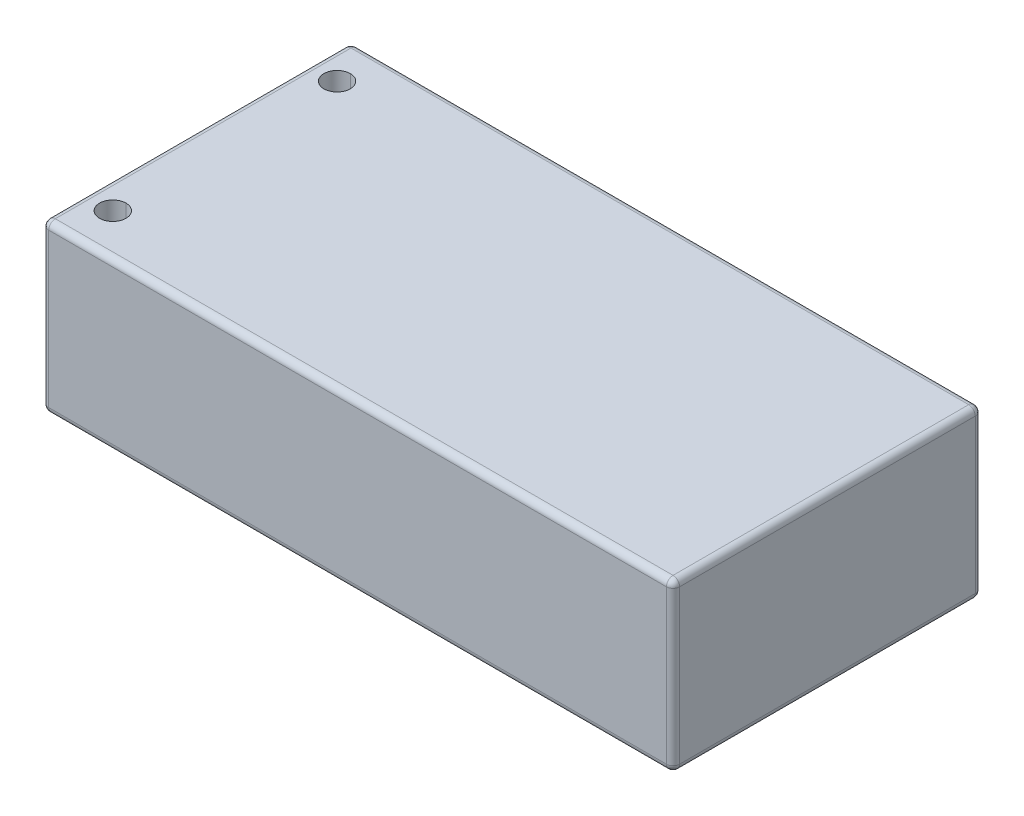
ISO-10303-21;
HEADER;
FILE_DESCRIPTION(('STEP AP214'),'2;1');
FILE_NAME('part.step','',(''),(''),'','','');
FILE_SCHEMA(('AUTOMOTIVE_DESIGN { 1 0 10303 214 1 1 1 1 }'));
ENDSEC;
DATA;
#1=APPLICATION_CONTEXT('core data for automotive mechanical design processes');
#2=APPLICATION_PROTOCOL_DEFINITION('international standard','automotive_design',2000,#1);
#3=PRODUCT_CONTEXT('',#1,'mechanical');
#4=PRODUCT('Part','Part','',(#3));
#5=PRODUCT_RELATED_PRODUCT_CATEGORY('part','',(#4));
#6=PRODUCT_DEFINITION_FORMATION('','',#4);
#7=PRODUCT_DEFINITION_CONTEXT('part definition',#1,'design');
#8=PRODUCT_DEFINITION('design','',#6,#7);
#9=PRODUCT_DEFINITION_SHAPE('','',#8);
#10=(LENGTH_UNIT() NAMED_UNIT(*) SI_UNIT(.MILLI.,.METRE.));
#11=(NAMED_UNIT(*) PLANE_ANGLE_UNIT() SI_UNIT($,.RADIAN.));
#12=(NAMED_UNIT(*) SI_UNIT($,.STERADIAN.) SOLID_ANGLE_UNIT());
#13=UNCERTAINTY_MEASURE_WITH_UNIT(LENGTH_MEASURE(1.E-05),#10,'distance_accuracy_value','');
#14=(GEOMETRIC_REPRESENTATION_CONTEXT(3) GLOBAL_UNCERTAINTY_ASSIGNED_CONTEXT((#13)) GLOBAL_UNIT_ASSIGNED_CONTEXT((#10,
#11,#12)) REPRESENTATION_CONTEXT('',''));
#15=CARTESIAN_POINT('',(0.,0.,0.));
#16=DIRECTION('',(0.,0.,1.));
#17=DIRECTION('',(1.,0.,0.));
#18=AXIS2_PLACEMENT_3D('',#15,#16,#17);
#19=CARTESIAN_POINT('',(4.3,22.25,-40.35));
#20=DIRECTION('',(0.,1.,0.));
#21=DIRECTION('',(1.,0.,0.));
#22=AXIS2_PLACEMENT_3D('',#19,#20,#21);
#23=PLANE('',#22);
#24=CARTESIAN_POINT('',(4.3,22.25,-40.35));
#25=DIRECTION('',(0.,1.,0.));
#26=DIRECTION('',(0.,0.,1.));
#27=AXIS2_PLACEMENT_3D('',#24,#25,#26);
#28=CIRCLE('',#27,2.);
#29=CARTESIAN_POINT('',(4.3,22.25,-38.35));
#30=VERTEX_POINT('',#29);
#31=CARTESIAN_POINT('',(4.3,22.25,-42.35));
#32=VERTEX_POINT('',#31);
#33=EDGE_CURVE('E10',#30,#32,#28,.T.);
#34=ORIENTED_EDGE('',*,*,#33,.T.);
#35=CARTESIAN_POINT('',(4.3,22.25,-40.35));
#36=DIRECTION('',(0.,1.,0.));
#37=DIRECTION('',(0.,0.,1.));
#38=AXIS2_PLACEMENT_3D('',#35,#36,#37);
#39=CIRCLE('',#38,2.);
#40=EDGE_CURVE('E304',#32,#30,#39,.T.);
#41=ORIENTED_EDGE('',*,*,#40,.T.);
#42=EDGE_LOOP('',(#34,#41));
#43=FACE_BOUND('',#42,.T.);
#44=ADVANCED_FACE('F16',(#43),#23,.T.);
#45=CARTESIAN_POINT('',(4.3,22.25,-40.35));
#46=DIRECTION('',(0.,1.,0.));
#47=DIRECTION('',(0.,0.,1.));
#48=AXIS2_PLACEMENT_3D('',#45,#46,#47);
#49=CYLINDRICAL_SURFACE('',#48,2.);
#50=DIRECTION('',(0.,1.,0.));
#51=VECTOR('',#50,1.);
#52=CARTESIAN_POINT('',(4.3,22.25,-42.35));
#53=LINE('',#52,#51);
#54=CARTESIAN_POINT('',(4.3,25.25,-42.35));
#55=VERTEX_POINT('',#54);
#56=EDGE_CURVE('E303',#32,#55,#53,.T.);
#57=ORIENTED_EDGE('',*,*,#56,.F.);
#58=ORIENTED_EDGE('',*,*,#33,.F.);
#59=DIRECTION('',(0.,1.,0.));
#60=VECTOR('',#59,1.);
#61=CARTESIAN_POINT('',(4.3,22.25,-38.35));
#62=LINE('',#61,#60);
#63=CARTESIAN_POINT('',(4.3,25.25,-38.35));
#64=VERTEX_POINT('',#63);
#65=EDGE_CURVE('E232',#30,#64,#62,.T.);
#66=ORIENTED_EDGE('',*,*,#65,.T.);
#67=CARTESIAN_POINT('',(4.3,25.25,-40.35));
#68=DIRECTION('',(0.,1.,0.));
#69=DIRECTION('',(0.,0.,1.));
#70=AXIS2_PLACEMENT_3D('',#67,#68,#69);
#71=CIRCLE('',#70,2.);
#72=EDGE_CURVE('E339',#64,#55,#71,.T.);
#73=ORIENTED_EDGE('',*,*,#72,.T.);
#74=EDGE_LOOP('',(#57,#58,#66,#73));
#75=FACE_BOUND('',#74,.T.);
#76=ADVANCED_FACE('F614',(#75),#49,.F.);
#77=CARTESIAN_POINT('',(4.3,22.25,-6.4));
#78=DIRECTION('',(0.,1.,0.));
#79=DIRECTION('',(1.,0.,0.));
#80=AXIS2_PLACEMENT_3D('',#77,#78,#79);
#81=PLANE('',#80);
#82=CARTESIAN_POINT('',(4.3,22.25,-6.4));
#83=DIRECTION('',(0.,1.,0.));
#84=DIRECTION('',(0.,0.,1.));
#85=AXIS2_PLACEMENT_3D('',#82,#83,#84);
#86=CIRCLE('',#85,2.);
#87=CARTESIAN_POINT('',(4.3,22.25,-4.4));
#88=VERTEX_POINT('',#87);
#89=CARTESIAN_POINT('',(4.3,22.25,-8.4));
#90=VERTEX_POINT('',#89);
#91=EDGE_CURVE('E27',#88,#90,#86,.T.);
#92=ORIENTED_EDGE('',*,*,#91,.T.);
#93=CARTESIAN_POINT('',(4.3,22.25,-6.4));
#94=DIRECTION('',(0.,1.,0.));
#95=DIRECTION('',(0.,0.,1.));
#96=AXIS2_PLACEMENT_3D('',#93,#94,#95);
#97=CIRCLE('',#96,2.);
#98=EDGE_CURVE('E236',#90,#88,#97,.T.);
#99=ORIENTED_EDGE('',*,*,#98,.T.);
#100=EDGE_LOOP('',(#92,#99));
#101=FACE_BOUND('',#100,.T.);
#102=ADVANCED_FACE('F443',(#101),#81,.T.);
#103=CARTESIAN_POINT('',(4.3,22.25,-6.4));
#104=DIRECTION('',(0.,1.,0.));
#105=DIRECTION('',(0.,0.,1.));
#106=AXIS2_PLACEMENT_3D('',#103,#104,#105);
#107=CYLINDRICAL_SURFACE('',#106,2.);
#108=DIRECTION('',(0.,1.,0.));
#109=VECTOR('',#108,1.);
#110=CARTESIAN_POINT('',(4.3,22.25,-8.4));
#111=LINE('',#110,#109);
#112=CARTESIAN_POINT('',(4.3,25.25,-8.4));
#113=VERTEX_POINT('',#112);
#114=EDGE_CURVE('E219',#90,#113,#111,.T.);
#115=ORIENTED_EDGE('',*,*,#114,.F.);
#116=ORIENTED_EDGE('',*,*,#91,.F.);
#117=DIRECTION('',(0.,1.,0.));
#118=VECTOR('',#117,1.);
#119=CARTESIAN_POINT('',(4.3,22.25,-4.4));
#120=LINE('',#119,#118);
#121=CARTESIAN_POINT('',(4.3,25.25,-4.4));
#122=VERTEX_POINT('',#121);
#123=EDGE_CURVE('E218',#88,#122,#120,.T.);
#124=ORIENTED_EDGE('',*,*,#123,.T.);
#125=CARTESIAN_POINT('',(4.3,25.25,-6.4));
#126=DIRECTION('',(0.,1.,0.));
#127=DIRECTION('',(0.,0.,1.));
#128=AXIS2_PLACEMENT_3D('',#125,#126,#127);
#129=CIRCLE('',#128,2.);
#130=EDGE_CURVE('E20',#122,#113,#129,.T.);
#131=ORIENTED_EDGE('',*,*,#130,.T.);
#132=EDGE_LOOP('',(#115,#116,#124,#131));
#133=FACE_BOUND('',#132,.T.);
#134=ADVANCED_FACE('F450',(#133),#107,.F.);
#135=CARTESIAN_POINT('',(1.,25.25,-45.75));
#136=DIRECTION('',(0.,-1.,0.));
#137=DIRECTION('',(0.,0.,-1.));
#138=AXIS2_PLACEMENT_3D('',#135,#136,#137);
#139=CYLINDRICAL_SURFACE('',#138,1.);
#140=CARTESIAN_POINT('',(1.,24.25,-45.75));
#141=DIRECTION('',(0.,-1.,0.));
#142=DIRECTION('',(0.,0.,1.));
#143=AXIS2_PLACEMENT_3D('',#140,#141,#142);
#144=CIRCLE('',#143,1.);
#145=CARTESIAN_POINT('',(0.,24.25,-45.75));
#146=VERTEX_POINT('',#145);
#147=CARTESIAN_POINT('',(1.,24.25,-46.75));
#148=VERTEX_POINT('',#147);
#149=EDGE_CURVE('E345',#146,#148,#144,.T.);
#150=ORIENTED_EDGE('',*,*,#149,.T.);
#151=DIRECTION('',(0.,1.,0.));
#152=VECTOR('',#151,1.);
#153=CARTESIAN_POINT('',(1.,25.25,-46.75));
#154=LINE('',#153,#152);
#155=CARTESIAN_POINT('',(1.,1.,-46.75));
#156=VERTEX_POINT('',#155);
#157=EDGE_CURVE('E354',#156,#148,#154,.T.);
#158=ORIENTED_EDGE('',*,*,#157,.F.);
#159=CARTESIAN_POINT('',(1.,1.,-45.75));
#160=DIRECTION('',(0.,1.,0.));
#161=DIRECTION('',(0.,0.,-1.));
#162=AXIS2_PLACEMENT_3D('',#159,#160,#161);
#163=CIRCLE('',#162,1.);
#164=CARTESIAN_POINT('',(0.,1.,-45.75));
#165=VERTEX_POINT('',#164);
#166=EDGE_CURVE('E348',#156,#165,#163,.T.);
#167=ORIENTED_EDGE('',*,*,#166,.T.);
#168=DIRECTION('',(0.,-1.,0.));
#169=VECTOR('',#168,1.);
#170=CARTESIAN_POINT('',(0.,25.25,-45.75));
#171=LINE('',#170,#169);
#172=EDGE_CURVE('E256',#146,#165,#171,.T.);
#173=ORIENTED_EDGE('',*,*,#172,.F.);
#174=EDGE_LOOP('',(#150,#158,#167,#173));
#175=FACE_BOUND('',#174,.T.);
#176=ADVANCED_FACE('F414',(#175),#139,.T.);
#177=CARTESIAN_POINT('',(1.,1.,-45.75));
#178=DIRECTION('',(0.,1.,0.));
#179=DIRECTION('',(1.,0.,0.));
#180=AXIS2_PLACEMENT_3D('',#177,#178,#179);
#181=SPHERICAL_SURFACE('',#180,1.);
#182=CARTESIAN_POINT('',(1.,1.,-45.75));
#183=DIRECTION('',(-1.,0.,0.));
#184=DIRECTION('',(0.,0.,1.));
#185=AXIS2_PLACEMENT_3D('',#182,#183,#184);
#186=CIRCLE('',#185,1.);
#187=CARTESIAN_POINT('',(1.,0.,-45.75));
#188=VERTEX_POINT('',#187);
#189=EDGE_CURVE('E42',#156,#188,#186,.T.);
#190=ORIENTED_EDGE('',*,*,#189,.T.);
#191=CARTESIAN_POINT('',(1.,1.,-45.75));
#192=DIRECTION('',(0.,0.,-1.));
#193=DIRECTION('',(-1.,0.,0.));
#194=AXIS2_PLACEMENT_3D('',#191,#192,#193);
#195=CIRCLE('',#194,1.);
#196=EDGE_CURVE('E225',#188,#165,#195,.T.);
#197=ORIENTED_EDGE('',*,*,#196,.T.);
#198=ORIENTED_EDGE('',*,*,#166,.F.);
#199=EDGE_LOOP('',(#190,#197,#198));
#200=FACE_BOUND('',#199,.T.);
#201=ADVANCED_FACE('F418',(#200),#181,.T.);
#202=CARTESIAN_POINT('',(1.,24.25,-45.75));
#203=DIRECTION('',(0.,1.,0.));
#204=DIRECTION('',(1.,0.,0.));
#205=AXIS2_PLACEMENT_3D('',#202,#203,#204);
#206=SPHERICAL_SURFACE('',#205,1.);
#207=CARTESIAN_POINT('',(1.,24.25,-45.75));
#208=DIRECTION('',(0.,0.,-1.));
#209=DIRECTION('',(-1.,0.,0.));
#210=AXIS2_PLACEMENT_3D('',#207,#208,#209);
#211=CIRCLE('',#210,1.);
#212=CARTESIAN_POINT('',(1.,25.25,-45.75));
#213=VERTEX_POINT('',#212);
#214=EDGE_CURVE('E228',#146,#213,#211,.T.);
#215=ORIENTED_EDGE('',*,*,#214,.T.);
#216=CARTESIAN_POINT('',(1.,24.25,-45.75));
#217=DIRECTION('',(-1.,0.,0.));
#218=DIRECTION('',(0.,0.,1.));
#219=AXIS2_PLACEMENT_3D('',#216,#217,#218);
#220=CIRCLE('',#219,1.);
#221=EDGE_CURVE('E231',#213,#148,#220,.T.);
#222=ORIENTED_EDGE('',*,*,#221,.T.);
#223=ORIENTED_EDGE('',*,*,#149,.F.);
#224=EDGE_LOOP('',(#215,#222,#223));
#225=FACE_BOUND('',#224,.T.);
#226=ADVANCED_FACE('F650',(#225),#206,.T.);
#227=CARTESIAN_POINT('',(0.,1.,-45.75));
#228=DIRECTION('',(1.,0.,0.));
#229=DIRECTION('',(0.,0.,-1.));
#230=AXIS2_PLACEMENT_3D('',#227,#228,#229);
#231=CYLINDRICAL_SURFACE('',#230,1.);
#232=CARTESIAN_POINT('',(94.5,1.,-45.75));
#233=DIRECTION('',(-1.,0.,0.));
#234=DIRECTION('',(0.,0.,-1.));
#235=AXIS2_PLACEMENT_3D('',#232,#233,#234);
#236=CIRCLE('',#235,1.);
#237=CARTESIAN_POINT('',(94.5,1.,-46.75));
#238=VERTEX_POINT('',#237);
#239=CARTESIAN_POINT('',(94.5,0.,-45.75));
#240=VERTEX_POINT('',#239);
#241=EDGE_CURVE('E245',#238,#240,#236,.T.);
#242=ORIENTED_EDGE('',*,*,#241,.T.);
#243=DIRECTION('',(1.,0.,0.));
#244=VECTOR('',#243,1.);
#245=CARTESIAN_POINT('',(95.5,0.,-45.75));
#246=LINE('',#245,#244);
#247=EDGE_CURVE('E187',#188,#240,#246,.T.);
#248=ORIENTED_EDGE('',*,*,#247,.F.);
#249=ORIENTED_EDGE('',*,*,#189,.F.);
#250=DIRECTION('',(-1.,0.,0.));
#251=VECTOR('',#250,1.);
#252=CARTESIAN_POINT('',(0.,1.,-46.75));
#253=LINE('',#252,#251);
#254=EDGE_CURVE('E344',#238,#156,#253,.T.);
#255=ORIENTED_EDGE('',*,*,#254,.F.);
#256=EDGE_LOOP('',(#242,#248,#249,#255));
#257=FACE_BOUND('',#256,.T.);
#258=ADVANCED_FACE('F644',(#257),#231,.T.);
#259=CARTESIAN_POINT('',(1.,1.,0.));
#260=DIRECTION('',(0.,0.,-1.));
#261=DIRECTION('',(-1.,0.,0.));
#262=AXIS2_PLACEMENT_3D('',#259,#260,#261);
#263=CYLINDRICAL_SURFACE('',#262,1.);
#264=CARTESIAN_POINT('',(1.,1.,-1.));
#265=DIRECTION('',(0.,0.,-1.));
#266=DIRECTION('',(1.,0.,0.));
#267=AXIS2_PLACEMENT_3D('',#264,#265,#266);
#268=CIRCLE('',#267,1.);
#269=CARTESIAN_POINT('',(1.,0.,-1.));
#270=VERTEX_POINT('',#269);
#271=CARTESIAN_POINT('',(0.,1.,-1.));
#272=VERTEX_POINT('',#271);
#273=EDGE_CURVE('E326',#270,#272,#268,.T.);
#274=ORIENTED_EDGE('',*,*,#273,.T.);
#275=DIRECTION('',(0.,0.,1.));
#276=VECTOR('',#275,1.);
#277=CARTESIAN_POINT('',(0.,1.,0.));
#278=LINE('',#277,#276);
#279=EDGE_CURVE('E251',#165,#272,#278,.T.);
#280=ORIENTED_EDGE('',*,*,#279,.F.);
#281=ORIENTED_EDGE('',*,*,#196,.F.);
#282=DIRECTION('',(0.,0.,-1.));
#283=VECTOR('',#282,1.);
#284=CARTESIAN_POINT('',(1.,0.,-46.75));
#285=LINE('',#284,#283);
#286=EDGE_CURVE('E250',#270,#188,#285,.T.);
#287=ORIENTED_EDGE('',*,*,#286,.F.);
#288=EDGE_LOOP('',(#274,#280,#281,#287));
#289=FACE_BOUND('',#288,.T.);
#290=ADVANCED_FACE('F422',(#289),#263,.T.);
#291=CARTESIAN_POINT('',(1.,24.25,0.));
#292=DIRECTION('',(0.,0.,1.));
#293=DIRECTION('',(1.,0.,0.));
#294=AXIS2_PLACEMENT_3D('',#291,#292,#293);
#295=CYLINDRICAL_SURFACE('',#294,1.);
#296=CARTESIAN_POINT('',(1.,24.25,-1.));
#297=DIRECTION('',(0.,0.,-1.));
#298=DIRECTION('',(1.,0.,0.));
#299=AXIS2_PLACEMENT_3D('',#296,#297,#298);
#300=CIRCLE('',#299,1.);
#301=CARTESIAN_POINT('',(0.,24.25,-1.));
#302=VERTEX_POINT('',#301);
#303=CARTESIAN_POINT('',(1.,25.25,-1.));
#304=VERTEX_POINT('',#303);
#305=EDGE_CURVE('E268',#302,#304,#300,.T.);
#306=ORIENTED_EDGE('',*,*,#305,.T.);
#307=DIRECTION('',(0.,0.,1.));
#308=VECTOR('',#307,1.);
#309=CARTESIAN_POINT('',(1.,25.25,0.));
#310=LINE('',#309,#308);
#311=EDGE_CURVE('E319',#213,#304,#310,.T.);
#312=ORIENTED_EDGE('',*,*,#311,.F.);
#313=ORIENTED_EDGE('',*,*,#214,.F.);
#314=DIRECTION('',(0.,0.,-1.));
#315=VECTOR('',#314,1.);
#316=CARTESIAN_POINT('',(0.,24.25,0.));
#317=LINE('',#316,#315);
#318=EDGE_CURVE('E259',#302,#146,#317,.T.);
#319=ORIENTED_EDGE('',*,*,#318,.F.);
#320=EDGE_LOOP('',(#306,#312,#313,#319));
#321=FACE_BOUND('',#320,.T.);
#322=ADVANCED_FACE('F643',(#321),#295,.T.);
#323=CARTESIAN_POINT('',(0.,24.25,-45.75));
#324=DIRECTION('',(-1.,0.,0.));
#325=DIRECTION('',(0.,0.,1.));
#326=AXIS2_PLACEMENT_3D('',#323,#324,#325);
#327=CYLINDRICAL_SURFACE('',#326,1.);
#328=CARTESIAN_POINT('',(94.5,24.25,-45.75));
#329=DIRECTION('',(-1.,0.,0.));
#330=DIRECTION('',(0.,0.,-1.));
#331=AXIS2_PLACEMENT_3D('',#328,#329,#330);
#332=CIRCLE('',#331,1.);
#333=CARTESIAN_POINT('',(94.5,25.25,-45.75));
#334=VERTEX_POINT('',#333);
#335=CARTESIAN_POINT('',(94.5,24.25,-46.75));
#336=VERTEX_POINT('',#335);
#337=EDGE_CURVE('E266',#334,#336,#332,.T.);
#338=ORIENTED_EDGE('',*,*,#337,.T.);
#339=DIRECTION('',(1.,0.,0.));
#340=VECTOR('',#339,1.);
#341=CARTESIAN_POINT('',(0.,24.25,-46.75));
#342=LINE('',#341,#340);
#343=EDGE_CURVE('E358',#148,#336,#342,.T.);
#344=ORIENTED_EDGE('',*,*,#343,.F.);
#345=ORIENTED_EDGE('',*,*,#221,.F.);
#346=DIRECTION('',(-1.,0.,0.));
#347=VECTOR('',#346,1.);
#348=CARTESIAN_POINT('',(0.,25.25,-45.75));
#349=LINE('',#348,#347);
#350=EDGE_CURVE('E324',#334,#213,#349,.T.);
#351=ORIENTED_EDGE('',*,*,#350,.F.);
#352=EDGE_LOOP('',(#338,#344,#345,#351));
#353=FACE_BOUND('',#352,.T.);
#354=ADVANCED_FACE('F677',(#353),#327,.T.);
#355=CARTESIAN_POINT('',(94.5,1.,-45.75));
#356=DIRECTION('',(0.,1.,0.));
#357=DIRECTION('',(1.,0.,0.));
#358=AXIS2_PLACEMENT_3D('',#355,#356,#357);
#359=SPHERICAL_SURFACE('',#358,1.);
#360=CARTESIAN_POINT('',(94.5,1.,-45.75));
#361=DIRECTION('',(0.,-1.,0.));
#362=DIRECTION('',(0.,0.,-1.));
#363=AXIS2_PLACEMENT_3D('',#360,#361,#362);
#364=CIRCLE('',#363,1.);
#365=CARTESIAN_POINT('',(95.5,1.,-45.75));
#366=VERTEX_POINT('',#365);
#367=EDGE_CURVE('E269',#238,#366,#364,.T.);
#368=ORIENTED_EDGE('',*,*,#367,.T.);
#369=CARTESIAN_POINT('',(94.5,1.,-45.75));
#370=DIRECTION('',(0.,0.,-1.));
#371=DIRECTION('',(-1.,0.,0.));
#372=AXIS2_PLACEMENT_3D('',#369,#370,#371);
#373=CIRCLE('',#372,1.);
#374=EDGE_CURVE('E286',#366,#240,#373,.T.);
#375=ORIENTED_EDGE('',*,*,#374,.T.);
#376=ORIENTED_EDGE('',*,*,#241,.F.);
#377=EDGE_LOOP('',(#368,#375,#376));
#378=FACE_BOUND('',#377,.T.);
#379=ADVANCED_FACE('F640',(#378),#359,.T.);
#380=CARTESIAN_POINT('',(1.,1.,-1.));
#381=DIRECTION('',(0.,1.,0.));
#382=DIRECTION('',(1.,0.,0.));
#383=AXIS2_PLACEMENT_3D('',#380,#381,#382);
#384=SPHERICAL_SURFACE('',#383,1.);
#385=CARTESIAN_POINT('',(1.,1.,-1.));
#386=DIRECTION('',(-1.,0.,0.));
#387=DIRECTION('',(0.,0.,1.));
#388=AXIS2_PLACEMENT_3D('',#385,#386,#387);
#389=CIRCLE('',#388,1.);
#390=CARTESIAN_POINT('',(1.,1.,0.));
#391=VERTEX_POINT('',#390);
#392=EDGE_CURVE('E376',#270,#391,#389,.T.);
#393=ORIENTED_EDGE('',*,*,#392,.T.);
#394=CARTESIAN_POINT('',(1.,1.,-1.));
#395=DIRECTION('',(0.,-1.,0.));
#396=DIRECTION('',(0.,0.,-1.));
#397=AXIS2_PLACEMENT_3D('',#394,#395,#396);
#398=CIRCLE('',#397,1.);
#399=EDGE_CURVE('E314',#391,#272,#398,.T.);
#400=ORIENTED_EDGE('',*,*,#399,.T.);
#401=ORIENTED_EDGE('',*,*,#273,.F.);
#402=EDGE_LOOP('',(#393,#400,#401));
#403=FACE_BOUND('',#402,.T.);
#404=ADVANCED_FACE('F428',(#403),#384,.T.);
#405=CARTESIAN_POINT('',(1.,24.25,-1.));
#406=DIRECTION('',(0.,1.,0.));
#407=DIRECTION('',(1.,0.,0.));
#408=AXIS2_PLACEMENT_3D('',#405,#406,#407);
#409=SPHERICAL_SURFACE('',#408,1.);
#410=CARTESIAN_POINT('',(1.,24.25,-1.));
#411=DIRECTION('',(0.,1.,0.));
#412=DIRECTION('',(0.,0.,1.));
#413=AXIS2_PLACEMENT_3D('',#410,#411,#412);
#414=CIRCLE('',#413,1.);
#415=CARTESIAN_POINT('',(1.,24.25,0.));
#416=VERTEX_POINT('',#415);
#417=EDGE_CURVE('E318',#302,#416,#414,.T.);
#418=ORIENTED_EDGE('',*,*,#417,.T.);
#419=CARTESIAN_POINT('',(1.,24.25,-1.));
#420=DIRECTION('',(-1.,0.,0.));
#421=DIRECTION('',(0.,0.,1.));
#422=AXIS2_PLACEMENT_3D('',#419,#420,#421);
#423=CIRCLE('',#422,1.);
#424=EDGE_CURVE('E194',#416,#304,#423,.T.);
#425=ORIENTED_EDGE('',*,*,#424,.T.);
#426=ORIENTED_EDGE('',*,*,#305,.F.);
#427=EDGE_LOOP('',(#418,#425,#426));
#428=FACE_BOUND('',#427,.T.);
#429=ADVANCED_FACE('F637',(#428),#409,.T.);
#430=CARTESIAN_POINT('',(94.5,24.25,-45.75));
#431=DIRECTION('',(0.,1.,0.));
#432=DIRECTION('',(1.,0.,0.));
#433=AXIS2_PLACEMENT_3D('',#430,#431,#432);
#434=SPHERICAL_SURFACE('',#433,1.);
#435=CARTESIAN_POINT('',(94.5,24.25,-45.75));
#436=DIRECTION('',(0.,0.,-1.));
#437=DIRECTION('',(-1.,0.,0.));
#438=AXIS2_PLACEMENT_3D('',#435,#436,#437);
#439=CIRCLE('',#438,1.);
#440=CARTESIAN_POINT('',(95.5,24.25,-45.75));
#441=VERTEX_POINT('',#440);
#442=EDGE_CURVE('E223',#334,#441,#439,.T.);
#443=ORIENTED_EDGE('',*,*,#442,.T.);
#444=CARTESIAN_POINT('',(94.5,24.25,-45.75));
#445=DIRECTION('',(0.,1.,0.));
#446=DIRECTION('',(0.,0.,1.));
#447=AXIS2_PLACEMENT_3D('',#444,#445,#446);
#448=CIRCLE('',#447,1.);
#449=EDGE_CURVE('E328',#441,#336,#448,.T.);
#450=ORIENTED_EDGE('',*,*,#449,.T.);
#451=ORIENTED_EDGE('',*,*,#337,.F.);
#452=EDGE_LOOP('',(#443,#450,#451));
#453=FACE_BOUND('',#452,.T.);
#454=ADVANCED_FACE('F631',(#453),#434,.T.);
#455=CARTESIAN_POINT('',(94.5,25.25,-45.75));
#456=DIRECTION('',(0.,-1.,0.));
#457=DIRECTION('',(0.,0.,-1.));
#458=AXIS2_PLACEMENT_3D('',#455,#456,#457);
#459=CYLINDRICAL_SURFACE('',#458,1.);
#460=ORIENTED_EDGE('',*,*,#449,.F.);
#461=DIRECTION('',(0.,1.,0.));
#462=VECTOR('',#461,1.);
#463=CARTESIAN_POINT('',(95.5,25.25,-45.75));
#464=LINE('',#463,#462);
#465=EDGE_CURVE('E260',#366,#441,#464,.T.);
#466=ORIENTED_EDGE('',*,*,#465,.F.);
#467=ORIENTED_EDGE('',*,*,#367,.F.);
#468=DIRECTION('',(0.,-1.,0.));
#469=VECTOR('',#468,1.);
#470=CARTESIAN_POINT('',(94.5,25.25,-46.75));
#471=LINE('',#470,#469);
#472=EDGE_CURVE('E340',#336,#238,#471,.T.);
#473=ORIENTED_EDGE('',*,*,#472,.F.);
#474=EDGE_LOOP('',(#460,#466,#467,#473));
#475=FACE_BOUND('',#474,.T.);
#476=ADVANCED_FACE('F628',(#475),#459,.T.);
#477=CARTESIAN_POINT('',(94.5,1.,0.));
#478=DIRECTION('',(0.,0.,1.));
#479=DIRECTION('',(1.,0.,0.));
#480=AXIS2_PLACEMENT_3D('',#477,#478,#479);
#481=CYLINDRICAL_SURFACE('',#480,1.);
#482=CARTESIAN_POINT('',(94.5,1.,-1.));
#483=DIRECTION('',(0.,0.,-1.));
#484=DIRECTION('',(1.,0.,0.));
#485=AXIS2_PLACEMENT_3D('',#482,#483,#484);
#486=CIRCLE('',#485,1.);
#487=CARTESIAN_POINT('',(95.5,1.,-1.));
#488=VERTEX_POINT('',#487);
#489=CARTESIAN_POINT('',(94.5,0.,-1.));
#490=VERTEX_POINT('',#489);
#491=EDGE_CURVE('E224',#488,#490,#486,.T.);
#492=ORIENTED_EDGE('',*,*,#491,.T.);
#493=DIRECTION('',(0.,0.,1.));
#494=VECTOR('',#493,1.);
#495=CARTESIAN_POINT('',(94.5,0.,0.));
#496=LINE('',#495,#494);
#497=EDGE_CURVE('E238',#240,#490,#496,.T.);
#498=ORIENTED_EDGE('',*,*,#497,.F.);
#499=ORIENTED_EDGE('',*,*,#374,.F.);
#500=DIRECTION('',(0.,0.,-1.));
#501=VECTOR('',#500,1.);
#502=CARTESIAN_POINT('',(95.5,1.,-46.75));
#503=LINE('',#502,#501);
#504=EDGE_CURVE('E265',#488,#366,#503,.T.);
#505=ORIENTED_EDGE('',*,*,#504,.F.);
#506=EDGE_LOOP('',(#492,#498,#499,#505));
#507=FACE_BOUND('',#506,.T.);
#508=ADVANCED_FACE('F282',(#507),#481,.T.);
#509=CARTESIAN_POINT('',(0.,1.,-1.));
#510=DIRECTION('',(-1.,0.,0.));
#511=DIRECTION('',(0.,0.,1.));
#512=AXIS2_PLACEMENT_3D('',#509,#510,#511);
#513=CYLINDRICAL_SURFACE('',#512,1.);
#514=CARTESIAN_POINT('',(94.5,1.,-1.));
#515=DIRECTION('',(-1.,0.,0.));
#516=DIRECTION('',(0.,0.,-1.));
#517=AXIS2_PLACEMENT_3D('',#514,#515,#516);
#518=CIRCLE('',#517,1.);
#519=CARTESIAN_POINT('',(94.5,1.,0.));
#520=VERTEX_POINT('',#519);
#521=EDGE_CURVE('E220',#490,#520,#518,.T.);
#522=ORIENTED_EDGE('',*,*,#521,.T.);
#523=DIRECTION('',(1.,0.,0.));
#524=VECTOR('',#523,1.);
#525=CARTESIAN_POINT('',(95.5,1.,0.));
#526=LINE('',#525,#524);
#527=EDGE_CURVE('E202',#391,#520,#526,.T.);
#528=ORIENTED_EDGE('',*,*,#527,.F.);
#529=ORIENTED_EDGE('',*,*,#392,.F.);
#530=DIRECTION('',(-1.,0.,0.));
#531=VECTOR('',#530,1.);
#532=CARTESIAN_POINT('',(0.,0.,-1.));
#533=LINE('',#532,#531);
#534=EDGE_CURVE('E242',#490,#270,#533,.T.);
#535=ORIENTED_EDGE('',*,*,#534,.F.);
#536=EDGE_LOOP('',(#522,#528,#529,#535));
#537=FACE_BOUND('',#536,.T.);
#538=ADVANCED_FACE('F674',(#537),#513,.T.);
#539=CARTESIAN_POINT('',(1.,25.25,-1.));
#540=DIRECTION('',(0.,-1.,0.));
#541=DIRECTION('',(0.,0.,-1.));
#542=AXIS2_PLACEMENT_3D('',#539,#540,#541);
#543=CYLINDRICAL_SURFACE('',#542,1.);
#544=ORIENTED_EDGE('',*,*,#399,.F.);
#545=DIRECTION('',(0.,-1.,0.));
#546=VECTOR('',#545,1.);
#547=CARTESIAN_POINT('',(1.,25.25,0.));
#548=LINE('',#547,#546);
#549=EDGE_CURVE('E209',#416,#391,#548,.T.);
#550=ORIENTED_EDGE('',*,*,#549,.F.);
#551=ORIENTED_EDGE('',*,*,#417,.F.);
#552=DIRECTION('',(0.,1.,0.));
#553=VECTOR('',#552,1.);
#554=CARTESIAN_POINT('',(0.,25.25,-1.));
#555=LINE('',#554,#553);
#556=EDGE_CURVE('E255',#272,#302,#555,.T.);
#557=ORIENTED_EDGE('',*,*,#556,.F.);
#558=EDGE_LOOP('',(#544,#550,#551,#557));
#559=FACE_BOUND('',#558,.T.);
#560=ADVANCED_FACE('F431',(#559),#543,.T.);
#561=CARTESIAN_POINT('',(0.,24.25,-1.));
#562=DIRECTION('',(1.,0.,0.));
#563=DIRECTION('',(0.,0.,-1.));
#564=AXIS2_PLACEMENT_3D('',#561,#562,#563);
#565=CYLINDRICAL_SURFACE('',#564,1.);
#566=CARTESIAN_POINT('',(94.5,24.25,-1.));
#567=DIRECTION('',(-1.,0.,0.));
#568=DIRECTION('',(0.,0.,-1.));
#569=AXIS2_PLACEMENT_3D('',#566,#567,#568);
#570=CIRCLE('',#569,1.);
#571=CARTESIAN_POINT('',(94.5,24.25,0.));
#572=VERTEX_POINT('',#571);
#573=CARTESIAN_POINT('',(94.5,25.25,-1.));
#574=VERTEX_POINT('',#573);
#575=EDGE_CURVE('E163',#572,#574,#570,.T.);
#576=ORIENTED_EDGE('',*,*,#575,.T.);
#577=DIRECTION('',(1.,0.,0.));
#578=VECTOR('',#577,1.);
#579=CARTESIAN_POINT('',(0.,25.25,-1.));
#580=LINE('',#579,#578);
#581=EDGE_CURVE('E323',#304,#574,#580,.T.);
#582=ORIENTED_EDGE('',*,*,#581,.F.);
#583=ORIENTED_EDGE('',*,*,#424,.F.);
#584=DIRECTION('',(-1.,0.,0.));
#585=VECTOR('',#584,1.);
#586=CARTESIAN_POINT('',(0.,24.25,0.));
#587=LINE('',#586,#585);
#588=EDGE_CURVE('E191',#572,#416,#587,.T.);
#589=ORIENTED_EDGE('',*,*,#588,.F.);
#590=EDGE_LOOP('',(#576,#582,#583,#589));
#591=FACE_BOUND('',#590,.T.);
#592=ADVANCED_FACE('F192',(#591),#565,.T.);
#593=CARTESIAN_POINT('',(94.5,24.25,0.));
#594=DIRECTION('',(0.,0.,-1.));
#595=DIRECTION('',(-1.,0.,0.));
#596=AXIS2_PLACEMENT_3D('',#593,#594,#595);
#597=CYLINDRICAL_SURFACE('',#596,1.);
#598=CARTESIAN_POINT('',(94.5,24.25,-1.));
#599=DIRECTION('',(0.,0.,-1.));
#600=DIRECTION('',(1.,0.,0.));
#601=AXIS2_PLACEMENT_3D('',#598,#599,#600);
#602=CIRCLE('',#601,1.);
#603=CARTESIAN_POINT('',(95.5,24.25,-1.));
#604=VERTEX_POINT('',#603);
#605=EDGE_CURVE('E168',#574,#604,#602,.T.);
#606=ORIENTED_EDGE('',*,*,#605,.T.);
#607=DIRECTION('',(0.,0.,1.));
#608=VECTOR('',#607,1.);
#609=CARTESIAN_POINT('',(95.5,24.25,0.));
#610=LINE('',#609,#608);
#611=EDGE_CURVE('E264',#441,#604,#610,.T.);
#612=ORIENTED_EDGE('',*,*,#611,.F.);
#613=ORIENTED_EDGE('',*,*,#442,.F.);
#614=DIRECTION('',(0.,0.,-1.));
#615=VECTOR('',#614,1.);
#616=CARTESIAN_POINT('',(94.5,25.25,0.));
#617=LINE('',#616,#615);
#618=EDGE_CURVE('E213',#574,#334,#617,.T.);
#619=ORIENTED_EDGE('',*,*,#618,.F.);
#620=EDGE_LOOP('',(#606,#612,#613,#619));
#621=FACE_BOUND('',#620,.T.);
#622=ADVANCED_FACE('F667',(#621),#597,.T.);
#623=CARTESIAN_POINT('',(94.5,1.,-1.));
#624=DIRECTION('',(0.,1.,0.));
#625=DIRECTION('',(1.,0.,0.));
#626=AXIS2_PLACEMENT_3D('',#623,#624,#625);
#627=SPHERICAL_SURFACE('',#626,1.);
#628=ORIENTED_EDGE('',*,*,#491,.F.);
#629=CARTESIAN_POINT('',(94.5,1.,-1.));
#630=DIRECTION('',(0.,-1.,0.));
#631=DIRECTION('',(0.,0.,-1.));
#632=AXIS2_PLACEMENT_3D('',#629,#630,#631);
#633=CIRCLE('',#632,1.);
#634=EDGE_CURVE('E174',#488,#520,#633,.T.);
#635=ORIENTED_EDGE('',*,*,#634,.T.);
#636=ORIENTED_EDGE('',*,*,#521,.F.);
#637=EDGE_LOOP('',(#628,#635,#636));
#638=FACE_BOUND('',#637,.T.);
#639=ADVANCED_FACE('F276',(#638),#627,.T.);
#640=CARTESIAN_POINT('',(94.5,24.25,-1.));
#641=DIRECTION('',(0.,1.,0.));
#642=DIRECTION('',(1.,0.,0.));
#643=AXIS2_PLACEMENT_3D('',#640,#641,#642);
#644=SPHERICAL_SURFACE('',#643,1.);
#645=ORIENTED_EDGE('',*,*,#575,.F.);
#646=CARTESIAN_POINT('',(94.5,24.25,-1.));
#647=DIRECTION('',(0.,1.,0.));
#648=DIRECTION('',(0.,0.,1.));
#649=AXIS2_PLACEMENT_3D('',#646,#647,#648);
#650=CIRCLE('',#649,1.);
#651=EDGE_CURVE('E166',#572,#604,#650,.T.);
#652=ORIENTED_EDGE('',*,*,#651,.T.);
#653=ORIENTED_EDGE('',*,*,#605,.F.);
#654=EDGE_LOOP('',(#645,#652,#653));
#655=FACE_BOUND('',#654,.T.);
#656=ADVANCED_FACE('F165',(#655),#644,.T.);
#657=CARTESIAN_POINT('',(94.5,25.25,-1.));
#658=DIRECTION('',(0.,-1.,0.));
#659=DIRECTION('',(0.,0.,-1.));
#660=AXIS2_PLACEMENT_3D('',#657,#658,#659);
#661=CYLINDRICAL_SURFACE('',#660,1.);
#662=ORIENTED_EDGE('',*,*,#651,.F.);
#663=DIRECTION('',(0.,1.,0.));
#664=VECTOR('',#663,1.);
#665=CARTESIAN_POINT('',(94.5,25.25,0.));
#666=LINE('',#665,#664);
#667=EDGE_CURVE('E182',#520,#572,#666,.T.);
#668=ORIENTED_EDGE('',*,*,#667,.F.);
#669=ORIENTED_EDGE('',*,*,#634,.F.);
#670=DIRECTION('',(0.,-1.,0.));
#671=VECTOR('',#670,1.);
#672=CARTESIAN_POINT('',(95.5,25.25,-1.));
#673=LINE('',#672,#671);
#674=EDGE_CURVE('E185',#604,#488,#673,.T.);
#675=ORIENTED_EDGE('',*,*,#674,.F.);
#676=EDGE_LOOP('',(#662,#668,#669,#675));
#677=FACE_BOUND('',#676,.T.);
#678=ADVANCED_FACE('F179',(#677),#661,.T.);
#679=CARTESIAN_POINT('',(0.,0.,0.));
#680=DIRECTION('',(0.,-1.,0.));
#681=DIRECTION('',(0.,0.,-1.));
#682=AXIS2_PLACEMENT_3D('',#679,#680,#681);
#683=PLANE('',#682);
#684=ORIENTED_EDGE('',*,*,#497,.T.);
#685=ORIENTED_EDGE('',*,*,#534,.T.);
#686=ORIENTED_EDGE('',*,*,#286,.T.);
#687=ORIENTED_EDGE('',*,*,#247,.T.);
#688=EDGE_LOOP('',(#684,#685,#686,#687));
#689=FACE_BOUND('',#688,.T.);
#690=ADVANCED_FACE('F457',(#689),#683,.T.);
#691=CARTESIAN_POINT('',(0.,25.25,0.));
#692=DIRECTION('',(0.,-1.,0.));
#693=DIRECTION('',(0.,0.,-1.));
#694=AXIS2_PLACEMENT_3D('',#691,#692,#693);
#695=PLANE('',#694);
#696=ORIENTED_EDGE('',*,*,#130,.F.);
#697=CARTESIAN_POINT('',(4.3,25.25,-6.4));
#698=DIRECTION('',(0.,1.,0.));
#699=DIRECTION('',(0.,0.,1.));
#700=AXIS2_PLACEMENT_3D('',#697,#698,#699);
#701=CIRCLE('',#700,2.);
#702=EDGE_CURVE('E214',#113,#122,#701,.T.);
#703=ORIENTED_EDGE('',*,*,#702,.F.);
#704=EDGE_LOOP('',(#696,#703));
#705=FACE_BOUND('',#704,.T.);
#706=ORIENTED_EDGE('',*,*,#72,.F.);
#707=CARTESIAN_POINT('',(4.3,25.25,-40.35));
#708=DIRECTION('',(0.,1.,0.));
#709=DIRECTION('',(0.,0.,1.));
#710=AXIS2_PLACEMENT_3D('',#707,#708,#709);
#711=CIRCLE('',#710,2.);
#712=EDGE_CURVE('E237',#55,#64,#711,.T.);
#713=ORIENTED_EDGE('',*,*,#712,.F.);
#714=EDGE_LOOP('',(#706,#713));
#715=FACE_BOUND('',#714,.T.);
#716=ORIENTED_EDGE('',*,*,#618,.T.);
#717=ORIENTED_EDGE('',*,*,#350,.T.);
#718=ORIENTED_EDGE('',*,*,#311,.T.);
#719=ORIENTED_EDGE('',*,*,#581,.T.);
#720=EDGE_LOOP('',(#716,#717,#718,#719));
#721=FACE_BOUND('',#720,.T.);
#722=ADVANCED_FACE('F453',(#705,#715,#721),#695,.F.);
#723=CARTESIAN_POINT('',(0.,25.25,-46.75));
#724=DIRECTION('',(0.,0.,1.));
#725=DIRECTION('',(1.,0.,0.));
#726=AXIS2_PLACEMENT_3D('',#723,#724,#725);
#727=PLANE('',#726);
#728=ORIENTED_EDGE('',*,*,#472,.T.);
#729=ORIENTED_EDGE('',*,*,#254,.T.);
#730=ORIENTED_EDGE('',*,*,#157,.T.);
#731=ORIENTED_EDGE('',*,*,#343,.T.);
#732=EDGE_LOOP('',(#728,#729,#730,#731));
#733=FACE_BOUND('',#732,.T.);
#734=ADVANCED_FACE('F456',(#733),#727,.F.);
#735=CARTESIAN_POINT('',(95.5,25.25,0.));
#736=DIRECTION('',(-1.,0.,0.));
#737=DIRECTION('',(0.,0.,1.));
#738=AXIS2_PLACEMENT_3D('',#735,#736,#737);
#739=PLANE('',#738);
#740=ORIENTED_EDGE('',*,*,#674,.T.);
#741=ORIENTED_EDGE('',*,*,#504,.T.);
#742=ORIENTED_EDGE('',*,*,#465,.T.);
#743=ORIENTED_EDGE('',*,*,#611,.T.);
#744=EDGE_LOOP('',(#740,#741,#742,#743));
#745=FACE_BOUND('',#744,.T.);
#746=ADVANCED_FACE('F291',(#745),#739,.F.);
#747=CARTESIAN_POINT('',(0.,25.25,0.));
#748=DIRECTION('',(0.,0.,-1.));
#749=DIRECTION('',(0.,-1.,0.));
#750=AXIS2_PLACEMENT_3D('',#747,#748,#749);
#751=PLANE('',#750);
#752=ORIENTED_EDGE('',*,*,#549,.T.);
#753=ORIENTED_EDGE('',*,*,#527,.T.);
#754=ORIENTED_EDGE('',*,*,#667,.T.);
#755=ORIENTED_EDGE('',*,*,#588,.T.);
#756=EDGE_LOOP('',(#752,#753,#754,#755));
#757=FACE_BOUND('',#756,.T.);
#758=ADVANCED_FACE('F200',(#757),#751,.F.);
#759=CARTESIAN_POINT('',(0.,25.25,0.));
#760=DIRECTION('',(1.,0.,0.));
#761=DIRECTION('',(0.,1.,0.));
#762=AXIS2_PLACEMENT_3D('',#759,#760,#761);
#763=PLANE('',#762);
#764=ORIENTED_EDGE('',*,*,#172,.T.);
#765=ORIENTED_EDGE('',*,*,#279,.T.);
#766=ORIENTED_EDGE('',*,*,#556,.T.);
#767=ORIENTED_EDGE('',*,*,#318,.T.);
#768=EDGE_LOOP('',(#764,#765,#766,#767));
#769=FACE_BOUND('',#768,.T.);
#770=ADVANCED_FACE('F409',(#769),#763,.F.);
#771=CARTESIAN_POINT('',(4.3,22.25,-6.4));
#772=DIRECTION('',(0.,1.,0.));
#773=DIRECTION('',(0.,0.,1.));
#774=AXIS2_PLACEMENT_3D('',#771,#772,#773);
#775=CYLINDRICAL_SURFACE('',#774,2.);
#776=ORIENTED_EDGE('',*,*,#98,.F.);
#777=ORIENTED_EDGE('',*,*,#114,.T.);
#778=ORIENTED_EDGE('',*,*,#702,.T.);
#779=ORIENTED_EDGE('',*,*,#123,.F.);
#780=EDGE_LOOP('',(#776,#777,#778,#779));
#781=FACE_BOUND('',#780,.T.);
#782=ADVANCED_FACE('F447',(#781),#775,.F.);
#783=CARTESIAN_POINT('',(4.3,22.25,-40.35));
#784=DIRECTION('',(0.,1.,0.));
#785=DIRECTION('',(0.,0.,1.));
#786=AXIS2_PLACEMENT_3D('',#783,#784,#785);
#787=CYLINDRICAL_SURFACE('',#786,2.);
#788=ORIENTED_EDGE('',*,*,#40,.F.);
#789=ORIENTED_EDGE('',*,*,#56,.T.);
#790=ORIENTED_EDGE('',*,*,#712,.T.);
#791=ORIENTED_EDGE('',*,*,#65,.F.);
#792=EDGE_LOOP('',(#788,#789,#790,#791));
#793=FACE_BOUND('',#792,.T.);
#794=ADVANCED_FACE('F18',(#793),#787,.F.);
#795=CLOSED_SHELL('',(#44,#76,#102,#134,#176,#201,#226,#258,#290,#322,#354,#379,#404,#429,#454,
#476,#508,#538,#560,#592,#622,#639,#656,#678,#690,#722,#734,#746,#758,#770,#782,#794));
#796=MANIFOLD_SOLID_BREP('B1',#795);
#797=ADVANCED_BREP_SHAPE_REPRESENTATION('',(#18,#796),#14);
#798=SHAPE_DEFINITION_REPRESENTATION(#9,#797);
ENDSEC;
END-ISO-10303-21;
